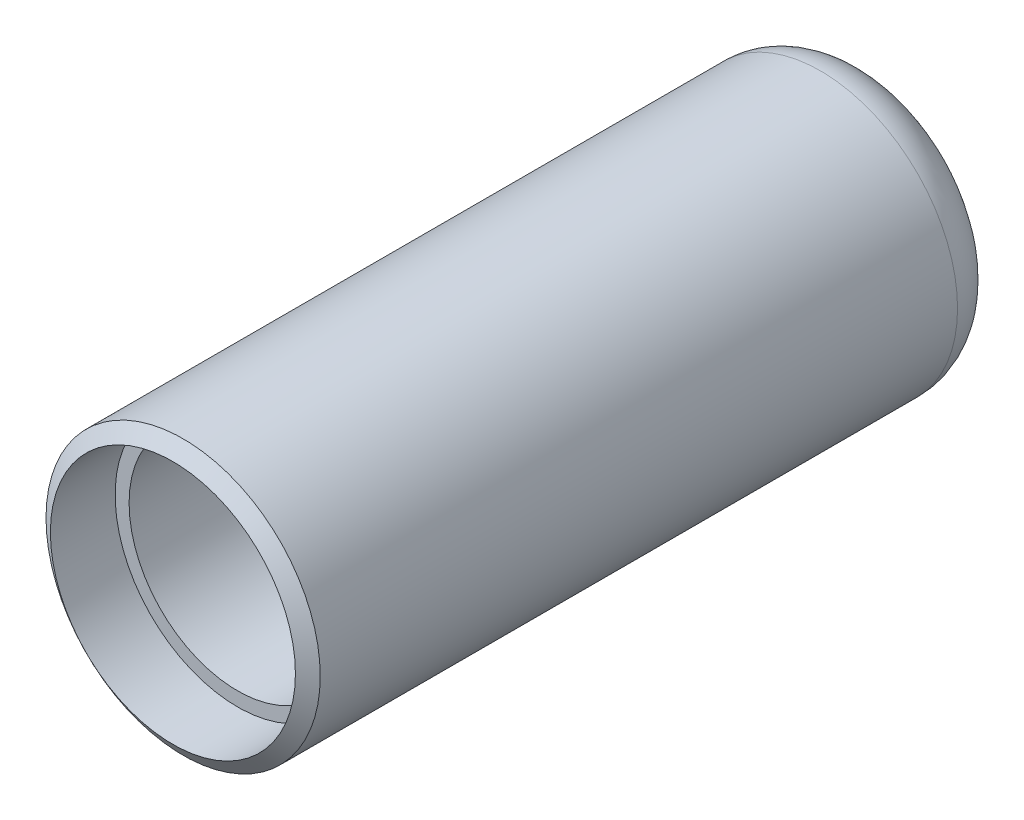
ISO-10303-21;
HEADER;
FILE_DESCRIPTION(('STEP AP214'),'2;1');
FILE_NAME('part.step','',(''),(''),'','','');
FILE_SCHEMA(('AUTOMOTIVE_DESIGN { 1 0 10303 214 1 1 1 1 }'));
ENDSEC;
DATA;
#1=APPLICATION_CONTEXT('core data for automotive mechanical design processes');
#2=APPLICATION_PROTOCOL_DEFINITION('international standard','automotive_design',2000,#1);
#3=PRODUCT_CONTEXT('',#1,'mechanical');
#4=PRODUCT('Part','Part','',(#3));
#5=PRODUCT_RELATED_PRODUCT_CATEGORY('part','',(#4));
#6=PRODUCT_DEFINITION_FORMATION('','',#4);
#7=PRODUCT_DEFINITION_CONTEXT('part definition',#1,'design');
#8=PRODUCT_DEFINITION('design','',#6,#7);
#9=PRODUCT_DEFINITION_SHAPE('','',#8);
#10=(LENGTH_UNIT() NAMED_UNIT(*) SI_UNIT(.MILLI.,.METRE.));
#11=(NAMED_UNIT(*) PLANE_ANGLE_UNIT() SI_UNIT($,.RADIAN.));
#12=(NAMED_UNIT(*) SI_UNIT($,.STERADIAN.) SOLID_ANGLE_UNIT());
#13=UNCERTAINTY_MEASURE_WITH_UNIT(LENGTH_MEASURE(1.E-05),#10,'distance_accuracy_value','');
#14=(GEOMETRIC_REPRESENTATION_CONTEXT(3) GLOBAL_UNCERTAINTY_ASSIGNED_CONTEXT((#13)) GLOBAL_UNIT_ASSIGNED_CONTEXT((#10,
#11,#12)) REPRESENTATION_CONTEXT('',''));
#15=CARTESIAN_POINT('',(0.,0.,0.));
#16=DIRECTION('',(0.,0.,1.));
#17=DIRECTION('',(1.,0.,0.));
#18=AXIS2_PLACEMENT_3D('',#15,#16,#17);
#19=CARTESIAN_POINT('',(0.,18.5000000000001,-286.999999999999));
#20=DIRECTION('',(0.,0.,0.999999999999998));
#21=DIRECTION('',(1.,0.,0.));
#22=AXIS2_PLACEMENT_3D('',#19,#20,#21);
#23=PLANE('',#22);
#24=CARTESIAN_POINT('',(0.,0.,-286.999999999999));
#25=DIRECTION('',(0.,0.,0.999999999999998));
#26=DIRECTION('',(1.,0.,0.));
#27=AXIS2_PLACEMENT_3D('',#24,#25,#26);
#28=CIRCLE('',#27,18.5);
#29=CARTESIAN_POINT('',(18.5,0.,-286.999999999999));
#30=VERTEX_POINT('',#29);
#31=EDGE_CURVE('E62',#30,#30,#28,.T.);
#32=ORIENTED_EDGE('',*,*,#31,.T.);
#33=EDGE_LOOP('',(#32));
#34=FACE_BOUND('',#33,.T.);
#35=ADVANCED_FACE('F49',(#34),#23,.T.);
#36=CARTESIAN_POINT('',(0.,0.,-276.999999999999));
#37=DIRECTION('',(0.,0.,0.999999999999998));
#38=DIRECTION('',(1.,0.,0.));
#39=AXIS2_PLACEMENT_3D('',#36,#37,#38);
#40=TOROIDAL_SURFACE('',#39,18.5,10.);
#41=CARTESIAN_POINT('',(0.,0.,-276.999999999999));
#42=DIRECTION('',(0.,0.,0.999999999999998));
#43=DIRECTION('',(1.,0.,0.));
#44=AXIS2_PLACEMENT_3D('',#41,#42,#43);
#45=CIRCLE('',#44,28.5);
#46=CARTESIAN_POINT('',(28.5000000000001,0.,-276.999999999999));
#47=VERTEX_POINT('',#46);
#48=EDGE_CURVE('E71',#47,#47,#45,.T.);
#49=ORIENTED_EDGE('',*,*,#48,.T.);
#50=EDGE_LOOP('',(#49));
#51=FACE_BOUND('',#50,.T.);
#52=ORIENTED_EDGE('',*,*,#31,.F.);
#53=EDGE_LOOP('',(#52));
#54=FACE_BOUND('',#53,.T.);
#55=ADVANCED_FACE('F85',(#51,#54),#40,.F.);
#56=CARTESIAN_POINT('',(0.,0.,37.2918206454791));
#57=DIRECTION('',(0.,0.,0.999999999999998));
#58=DIRECTION('',(1.,0.,0.));
#59=AXIS2_PLACEMENT_3D('',#56,#57,#58);
#60=CYLINDRICAL_SURFACE('',#59,28.5);
#61=CARTESIAN_POINT('',(0.,0.,-129.));
#62=DIRECTION('',(0.,0.,0.999999999999998));
#63=DIRECTION('',(1.,0.,0.));
#64=AXIS2_PLACEMENT_3D('',#61,#62,#63);
#65=CIRCLE('',#64,28.5);
#66=CARTESIAN_POINT('',(28.5000000000001,0.,-128.999999999999));
#67=VERTEX_POINT('',#66);
#68=EDGE_CURVE('E65',#67,#67,#65,.T.);
#69=CARTESIAN_POINT('',(28.5000000000001,0.,-276.999999999999));
#70=CARTESIAN_POINT('',(28.5000000000001,0.,-275.458333333332));
#71=CARTESIAN_POINT('',(28.5000000000001,0.,-273.916666666666));
#72=CARTESIAN_POINT('',(28.5000000000001,0.,-270.833333333332));
#73=CARTESIAN_POINT('',(28.5000000000001,0.,-269.291666666666));
#74=CARTESIAN_POINT('',(28.5000000000001,0.,-266.208333333332));
#75=CARTESIAN_POINT('',(28.5000000000001,0.,-264.666666666666));
#76=CARTESIAN_POINT('',(28.5000000000001,0.,-261.583333333332));
#77=CARTESIAN_POINT('',(28.5000000000001,0.,-260.041666666666));
#78=CARTESIAN_POINT('',(28.5000000000001,0.,-256.958333333332));
#79=CARTESIAN_POINT('',(28.5000000000001,0.,-255.416666666666));
#80=CARTESIAN_POINT('',(28.5000000000001,0.,-252.333333333332));
#81=CARTESIAN_POINT('',(28.5000000000001,0.,-250.791666666666));
#82=CARTESIAN_POINT('',(28.5000000000001,0.,-247.708333333332));
#83=CARTESIAN_POINT('',(28.5000000000001,0.,-246.166666666666));
#84=CARTESIAN_POINT('',(28.5000000000001,0.,-243.083333333332));
#85=CARTESIAN_POINT('',(28.5000000000001,0.,-241.541666666666));
#86=CARTESIAN_POINT('',(28.5000000000001,0.,-238.458333333332));
#87=CARTESIAN_POINT('',(28.5000000000001,0.,-236.916666666666));
#88=CARTESIAN_POINT('',(28.5000000000001,0.,-233.833333333332));
#89=CARTESIAN_POINT('',(28.5000000000001,0.,-232.291666666666));
#90=CARTESIAN_POINT('',(28.5000000000001,0.,-229.208333333332));
#91=CARTESIAN_POINT('',(28.5000000000001,0.,-227.666666666666));
#92=CARTESIAN_POINT('',(28.5000000000001,0.,-224.583333333332));
#93=CARTESIAN_POINT('',(28.5000000000001,0.,-223.041666666666));
#94=CARTESIAN_POINT('',(28.5000000000001,0.,-219.958333333332));
#95=CARTESIAN_POINT('',(28.5000000000001,0.,-218.416666666666));
#96=CARTESIAN_POINT('',(28.5000000000001,0.,-215.333333333332));
#97=CARTESIAN_POINT('',(28.5000000000001,0.,-213.791666666666));
#98=CARTESIAN_POINT('',(28.5000000000001,0.,-210.708333333332));
#99=CARTESIAN_POINT('',(28.5000000000001,0.,-209.166666666666));
#100=CARTESIAN_POINT('',(28.5000000000001,0.,-206.083333333333));
#101=CARTESIAN_POINT('',(28.5000000000001,0.,-204.541666666666));
#102=CARTESIAN_POINT('',(28.5000000000001,0.,-201.458333333333));
#103=CARTESIAN_POINT('',(28.5000000000001,0.,-199.916666666666));
#104=CARTESIAN_POINT('',(28.5000000000001,0.,-196.833333333333));
#105=CARTESIAN_POINT('',(28.5000000000001,0.,-195.291666666666));
#106=CARTESIAN_POINT('',(28.5000000000001,0.,-192.208333333333));
#107=CARTESIAN_POINT('',(28.5000000000001,0.,-190.666666666666));
#108=CARTESIAN_POINT('',(28.5000000000001,0.,-187.583333333333));
#109=CARTESIAN_POINT('',(28.5000000000001,0.,-186.041666666666));
#110=CARTESIAN_POINT('',(28.5000000000001,0.,-182.958333333333));
#111=CARTESIAN_POINT('',(28.5000000000001,0.,-181.416666666666));
#112=CARTESIAN_POINT('',(28.5000000000001,0.,-178.333333333333));
#113=CARTESIAN_POINT('',(28.5000000000001,0.,-176.791666666666));
#114=CARTESIAN_POINT('',(28.5000000000001,0.,-173.708333333333));
#115=CARTESIAN_POINT('',(28.5000000000001,0.,-172.166666666666));
#116=CARTESIAN_POINT('',(28.5000000000001,0.,-169.083333333333));
#117=CARTESIAN_POINT('',(28.5000000000001,0.,-167.541666666666));
#118=CARTESIAN_POINT('',(28.5000000000001,0.,-164.458333333333));
#119=CARTESIAN_POINT('',(28.5000000000001,0.,-162.916666666666));
#120=CARTESIAN_POINT('',(28.5000000000001,0.,-159.833333333333));
#121=CARTESIAN_POINT('',(28.5000000000001,0.,-158.291666666666));
#122=CARTESIAN_POINT('',(28.5000000000001,0.,-155.208333333333));
#123=CARTESIAN_POINT('',(28.5000000000001,0.,-153.666666666666));
#124=CARTESIAN_POINT('',(28.5000000000001,0.,-150.583333333333));
#125=CARTESIAN_POINT('',(28.5000000000001,0.,-149.041666666666));
#126=CARTESIAN_POINT('',(28.5000000000001,0.,-145.958333333333));
#127=CARTESIAN_POINT('',(28.5000000000001,0.,-144.416666666666));
#128=CARTESIAN_POINT('',(28.5000000000001,0.,-141.333333333333));
#129=CARTESIAN_POINT('',(28.5000000000001,0.,-139.791666666666));
#130=CARTESIAN_POINT('',(28.5000000000001,0.,-136.708333333333));
#131=CARTESIAN_POINT('',(28.5000000000001,0.,-135.166666666666));
#132=CARTESIAN_POINT('',(28.5000000000001,0.,-132.083333333333));
#133=CARTESIAN_POINT('',(28.5000000000001,0.,-130.541666666666));
#134=CARTESIAN_POINT('',(28.5000000000001,0.,-128.999999999999));
#135=B_SPLINE_CURVE_WITH_KNOTS('',3,(#69,#70,#71,#72,#73,#74,#75,#76,#77,#78,#79,#80,#81,#82,
#83,#84,#85,#86,#87,#88,#89,#90,#91,#92,#93,#94,#95,#96,#97,#98,#99,#100,#101,#102,#103,#104,
#105,#106,#107,#108,#109,#110,#111,#112,#113,#114,#115,#116,#117,#118,#119,#120,#121,#122,#123,
#124,#125,#126,#127,#128,#129,#130,#131,#132,#133,#134),.UNSPECIFIED.,.F.,.F.,(4,2,2,2,2,2,2,2,
2,2,2,2,2,2,2,2,2,2,2,2,2,2,2,2,2,2,2,2,2,2,2,2,4),(0.,4.62499999999999,9.24999999999998,13.875,
18.5,23.1249999999999,27.7499999999999,32.3749999999999,36.9999999999999,41.6249999999999,
46.2499999999999,50.8749999999998,55.4999999999998,60.1249999999998,64.7499999999998,
69.3749999999998,73.9999999999997,78.6249999999997,83.2499999999997,87.8749999999997,
92.4999999999997,97.1249999999997,101.75,106.375,111.,115.625,120.25,124.875,129.5,134.125,
138.75,143.375,148.),.UNSPECIFIED.);
#136=EDGE_CURVE('BSEAM87',#47,#67,#135,.T.);
#137=ORIENTED_EDGE('',*,*,#48,.F.);
#138=ORIENTED_EDGE('',*,*,#68,.T.);
#139=ORIENTED_EDGE('',*,*,#136,.T.);
#140=ORIENTED_EDGE('',*,*,#136,.F.);
#141=EDGE_LOOP('',(#137,#139,#138,#140));
#142=FACE_BOUND('',#141,.T.);
#143=ADVANCED_FACE('F87',(#142),#60,.F.);
#144=CARTESIAN_POINT('',(0.,0.,-112.));
#145=DIRECTION('',(0.,0.,-0.999999999999998));
#146=DIRECTION('',(-1.,0.,0.));
#147=AXIS2_PLACEMENT_3D('',#144,#145,#146);
#148=CONICAL_SURFACE('',#147,32.165,0.959931088596876);
#149=CARTESIAN_POINT('',(0.,0.,-112.));
#150=DIRECTION('',(0.,0.,0.999999999999998));
#151=DIRECTION('',(1.,0.,0.));
#152=AXIS2_PLACEMENT_3D('',#149,#150,#151);
#153=CIRCLE('',#152,32.165);
#154=CARTESIAN_POINT('',(-32.1650000000001,0.,-112.));
#155=VERTEX_POINT('',#154);
#156=EDGE_CURVE('E67',#155,#155,#153,.T.);
#157=CARTESIAN_POINT('',(0.,0.,-114.685295909034));
#158=DIRECTION('',(0.,0.,-0.999999999999998));
#159=DIRECTION('',(-1.,0.,0.));
#160=AXIS2_PLACEMENT_3D('',#157,#158,#159);
#161=CIRCLE('',#160,36.);
#162=CARTESIAN_POINT('',(-36.0000000000001,0.,-114.685295909034));
#163=VERTEX_POINT('',#162);
#164=EDGE_CURVE('E53',#163,#163,#161,.F.);
#165=CARTESIAN_POINT('',(-32.1650000000001,0.,-112.));
#166=CARTESIAN_POINT('',(-32.2049479166667,0.,-112.027971832386));
#167=CARTESIAN_POINT('',(-32.2448958333334,0.,-112.055943664771));
#168=CARTESIAN_POINT('',(-32.3247916666667,0.,-112.111887329543));
#169=CARTESIAN_POINT('',(-32.3647395833334,0.,-112.139859161929));
#170=CARTESIAN_POINT('',(-32.4446354166667,0.,-112.1958028267));
#171=CARTESIAN_POINT('',(-32.4845833333334,0.,-112.223774659086));
#172=CARTESIAN_POINT('',(-32.5644791666667,0.,-112.279718323857));
#173=CARTESIAN_POINT('',(-32.6044270833334,0.,-112.307690156243));
#174=CARTESIAN_POINT('',(-32.6843229166667,0.,-112.363633821015));
#175=CARTESIAN_POINT('',(-32.7242708333334,0.,-112.391605653401));
#176=CARTESIAN_POINT('',(-32.8041666666667,0.,-112.447549318172));
#177=CARTESIAN_POINT('',(-32.8441145833334,0.,-112.475521150558));
#178=CARTESIAN_POINT('',(-32.9240104166667,0.,-112.531464815329));
#179=CARTESIAN_POINT('',(-32.9639583333334,0.,-112.559436647715));
#180=CARTESIAN_POINT('',(-33.0438541666668,0.,-112.615380312487));
#181=CARTESIAN_POINT('',(-33.0838020833334,0.,-112.643352144873));
#182=CARTESIAN_POINT('',(-33.1636979166667,0.,-112.699295809644));
#183=CARTESIAN_POINT('',(-33.2036458333334,0.,-112.72726764203));
#184=CARTESIAN_POINT('',(-33.2835416666667,0.,-112.783211306801));
#185=CARTESIAN_POINT('',(-33.3234895833334,0.,-112.811183139187));
#186=CARTESIAN_POINT('',(-33.4033854166668,0.,-112.867126803959));
#187=CARTESIAN_POINT('',(-33.4433333333334,0.,-112.895098636344));
#188=CARTESIAN_POINT('',(-33.5232291666667,0.,-112.951042301116));
#189=CARTESIAN_POINT('',(-33.5631770833334,0.,-112.979014133502));
#190=CARTESIAN_POINT('',(-33.6430729166667,0.,-113.034957798273));
#191=CARTESIAN_POINT('',(-33.6830208333334,0.,-113.062929630659));
#192=CARTESIAN_POINT('',(-33.7629166666667,0.,-113.118873295431));
#193=CARTESIAN_POINT('',(-33.8028645833334,0.,-113.146845127816));
#194=CARTESIAN_POINT('',(-33.8827604166667,0.,-113.202788792588));
#195=CARTESIAN_POINT('',(-33.9227083333334,0.,-113.230760624974));
#196=CARTESIAN_POINT('',(-34.0026041666667,0.,-113.286704289745));
#197=CARTESIAN_POINT('',(-34.0425520833334,0.,-113.314676122131));
#198=CARTESIAN_POINT('',(-34.1224479166668,0.,-113.370619786903));
#199=CARTESIAN_POINT('',(-34.1623958333334,0.,-113.398591619288));
#200=CARTESIAN_POINT('',(-34.2422916666668,0.,-113.45453528406));
#201=CARTESIAN_POINT('',(-34.2822395833334,0.,-113.482507116446));
#202=CARTESIAN_POINT('',(-34.3621354166668,0.,-113.538450781217));
#203=CARTESIAN_POINT('',(-34.4020833333334,0.,-113.566422613603));
#204=CARTESIAN_POINT('',(-34.4819791666668,0.,-113.622366278375));
#205=CARTESIAN_POINT('',(-34.5219270833334,0.,-113.65033811076));
#206=CARTESIAN_POINT('',(-34.6018229166668,0.,-113.706281775532));
#207=CARTESIAN_POINT('',(-34.6417708333334,0.,-113.734253607918));
#208=CARTESIAN_POINT('',(-34.7216666666668,0.,-113.790197272689));
#209=CARTESIAN_POINT('',(-34.7616145833334,0.,-113.818169105075));
#210=CARTESIAN_POINT('',(-34.8415104166668,0.,-113.874112769847));
#211=CARTESIAN_POINT('',(-34.8814583333334,0.,-113.902084602232));
#212=CARTESIAN_POINT('',(-34.9613541666668,0.,-113.958028267004));
#213=CARTESIAN_POINT('',(-35.0013020833334,0.,-113.98600009939));
#214=CARTESIAN_POINT('',(-35.0811979166668,0.,-114.041943764161));
#215=CARTESIAN_POINT('',(-35.1211458333334,0.,-114.069915596547));
#216=CARTESIAN_POINT('',(-35.2010416666668,0.,-114.125859261319));
#217=CARTESIAN_POINT('',(-35.2409895833334,0.,-114.153831093704));
#218=CARTESIAN_POINT('',(-35.3208854166668,0.,-114.209774758476));
#219=CARTESIAN_POINT('',(-35.3608333333334,0.,-114.237746590862));
#220=CARTESIAN_POINT('',(-35.4407291666668,0.,-114.293690255633));
#221=CARTESIAN_POINT('',(-35.4806770833334,0.,-114.321662088019));
#222=CARTESIAN_POINT('',(-35.5605729166668,0.,-114.377605752791));
#223=CARTESIAN_POINT('',(-35.6005208333334,0.,-114.405577585176));
#224=CARTESIAN_POINT('',(-35.6804166666668,0.,-114.461521249948));
#225=CARTESIAN_POINT('',(-35.7203645833334,0.,-114.489493082334));
#226=CARTESIAN_POINT('',(-35.8002604166668,0.,-114.545436747105));
#227=CARTESIAN_POINT('',(-35.8402083333334,0.,-114.573408579491));
#228=CARTESIAN_POINT('',(-35.9201041666668,0.,-114.629352244262));
#229=CARTESIAN_POINT('',(-35.9600520833334,0.,-114.657324076648));
#230=CARTESIAN_POINT('',(-36.0000000000001,0.,-114.685295909034));
#231=B_SPLINE_CURVE_WITH_KNOTS('',3,(#165,#166,#167,#168,#169,#170,#171,#172,#173,#174,#175,
#176,#177,#178,#179,#180,#181,#182,#183,#184,#185,#186,#187,#188,#189,#190,#191,#192,#193,#194,
#195,#196,#197,#198,#199,#200,#201,#202,#203,#204,#205,#206,#207,#208,#209,#210,#211,#212,#213,
#214,#215,#216,#217,#218,#219,#220,#221,#222,#223,#224,#225,#226,#227,#228,#229,#230),
.UNSPECIFIED.,.F.,.F.,(4,2,2,2,2,2,2,2,2,2,2,2,2,2,2,2,2,2,2,2,2,2,2,2,2,2,2,2,2,2,2,2,4),(0.,
0.146302204621889,0.29260440924377,0.438906613865651,0.585208818487533,0.731511023109414,
0.877813227731295,1.02411543235318,1.17041763697507,1.31671984159695,1.46302204621883,
1.60932425084071,1.75562645546259,1.90192866008447,2.04823086470635,2.19453306932823,
2.34083527395011,2.487137478572,2.63343968319388,2.77974188781577,2.92604409243765,
3.07234629705953,3.2186485016814,3.36495070630328,3.51125291092517,3.65755511554705,
3.80385732016894,3.95015952479082,4.0964617294127,4.24276393403458,4.38906613865646,
4.53536834327834,4.68167054790022),.UNSPECIFIED.);
#232=EDGE_CURVE('BSEAM94',#155,#163,#231,.T.);
#233=ORIENTED_EDGE('',*,*,#156,.F.);
#234=ORIENTED_EDGE('',*,*,#164,.T.);
#235=ORIENTED_EDGE('',*,*,#232,.T.);
#236=ORIENTED_EDGE('',*,*,#232,.F.);
#237=EDGE_LOOP('',(#233,#235,#234,#236));
#238=FACE_BOUND('',#237,.T.);
#239=ADVANCED_FACE('F94',(#238),#148,.T.);
#240=CARTESIAN_POINT('',(0.,0.,24.8517491993101));
#241=DIRECTION('',(0.,0.,0.999999999999998));
#242=DIRECTION('',(1.,0.,0.));
#243=AXIS2_PLACEMENT_3D('',#240,#241,#242);
#244=CYLINDRICAL_SURFACE('',#243,32.165);
#245=ORIENTED_EDGE('',*,*,#156,.T.);
#246=EDGE_LOOP('',(#245));
#247=FACE_BOUND('',#246,.T.);
#248=CARTESIAN_POINT('',(0.,0.,-129.));
#249=DIRECTION('',(0.,0.,0.999999999999998));
#250=DIRECTION('',(1.,0.,0.));
#251=AXIS2_PLACEMENT_3D('',#248,#249,#250);
#252=CIRCLE('',#251,32.165);
#253=CARTESIAN_POINT('',(32.1650000000001,0.,-129.));
#254=VERTEX_POINT('',#253);
#255=EDGE_CURVE('E73',#254,#254,#252,.T.);
#256=ORIENTED_EDGE('',*,*,#255,.F.);
#257=EDGE_LOOP('',(#256));
#258=FACE_BOUND('',#257,.T.);
#259=ADVANCED_FACE('F116',(#247,#258),#244,.F.);
#260=CARTESIAN_POINT('',(0.,32.1650000000001,-129.));
#261=DIRECTION('',(0.,0.,0.999999999999998));
#262=DIRECTION('',(1.,0.,0.));
#263=AXIS2_PLACEMENT_3D('',#260,#261,#262);
#264=PLANE('',#263);
#265=ORIENTED_EDGE('',*,*,#68,.F.);
#266=EDGE_LOOP('',(#265));
#267=FACE_BOUND('',#266,.T.);
#268=ORIENTED_EDGE('',*,*,#255,.T.);
#269=EDGE_LOOP('',(#268));
#270=FACE_BOUND('',#269,.T.);
#271=ADVANCED_FACE('F102',(#267,#270),#264,.T.);
#272=CARTESIAN_POINT('',(0.,0.,77.9302783936928));
#273=DIRECTION('',(0.,0.,0.999999999999998));
#274=DIRECTION('',(1.,0.,0.));
#275=AXIS2_PLACEMENT_3D('',#272,#273,#274);
#276=CYLINDRICAL_SURFACE('',#275,36.);
#277=CARTESIAN_POINT('',(0.,0.,-281.999999999999));
#278=DIRECTION('',(0.,0.,0.999999999999998));
#279=DIRECTION('',(1.,0.,0.));
#280=AXIS2_PLACEMENT_3D('',#277,#278,#279);
#281=CIRCLE('',#280,36.);
#282=CARTESIAN_POINT('',(36.0000000000001,0.,-281.999999999999));
#283=VERTEX_POINT('',#282);
#284=EDGE_CURVE('E57',#283,#283,#281,.T.);
#285=ORIENTED_EDGE('',*,*,#284,.T.);
#286=EDGE_LOOP('',(#285));
#287=FACE_BOUND('',#286,.T.);
#288=ORIENTED_EDGE('',*,*,#164,.F.);
#289=EDGE_LOOP('',(#288));
#290=FACE_BOUND('',#289,.T.);
#291=ADVANCED_FACE('F100',(#287,#290),#276,.T.);
#292=CARTESIAN_POINT('',(0.,23.0000000000001,-294.999999999999));
#293=DIRECTION('',(0.,0.,0.999999999999998));
#294=DIRECTION('',(1.,0.,0.));
#295=AXIS2_PLACEMENT_3D('',#292,#293,#294);
#296=PLANE('',#295);
#297=CARTESIAN_POINT('',(0.,0.,-294.999999999999));
#298=DIRECTION('',(0.,0.,0.999999999999998));
#299=DIRECTION('',(1.,0.,0.));
#300=AXIS2_PLACEMENT_3D('',#297,#298,#299);
#301=CIRCLE('',#300,23.);
#302=CARTESIAN_POINT('',(23.0000000000001,0.,-294.999999999999));
#303=VERTEX_POINT('',#302);
#304=EDGE_CURVE('E11',#303,#303,#301,.T.);
#305=ORIENTED_EDGE('',*,*,#304,.F.);
#306=EDGE_LOOP('',(#305));
#307=FACE_BOUND('',#306,.T.);
#308=ADVANCED_FACE('F51',(#307),#296,.F.);
#309=CARTESIAN_POINT('',(0.,0.,-281.999999999999));
#310=DIRECTION('',(0.,0.,0.999999999999998));
#311=DIRECTION('',(1.,0.,0.));
#312=AXIS2_PLACEMENT_3D('',#309,#310,#311);
#313=TOROIDAL_SURFACE('',#312,23.,13.);
#314=ORIENTED_EDGE('',*,*,#284,.F.);
#315=EDGE_LOOP('',(#314));
#316=FACE_BOUND('',#315,.T.);
#317=ORIENTED_EDGE('',*,*,#304,.T.);
#318=EDGE_LOOP('',(#317));
#319=FACE_BOUND('',#318,.T.);
#320=ADVANCED_FACE('F104',(#316,#319),#313,.T.);
#321=CLOSED_SHELL('',(#35,#55,#143,#239,#259,#271,#291,#308,#320));
#322=MANIFOLD_SOLID_BREP('B2',#321);
#323=ADVANCED_BREP_SHAPE_REPRESENTATION('',(#18,#322),#14);
#324=SHAPE_DEFINITION_REPRESENTATION(#9,#323);
ENDSEC;
END-ISO-10303-21;
